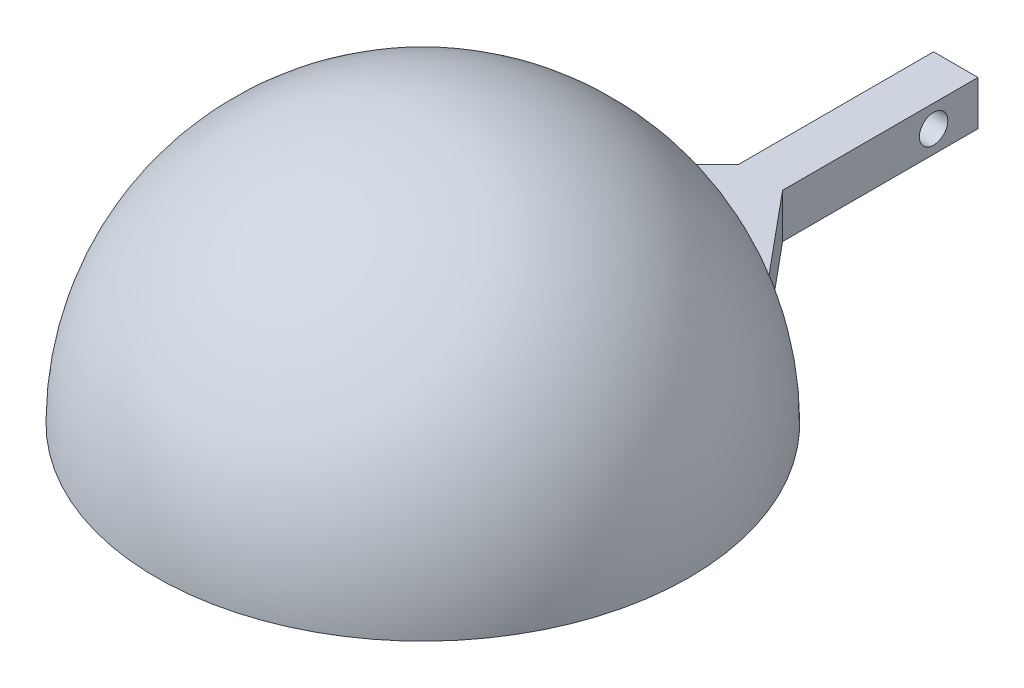
ISO-10303-21;
HEADER;
FILE_DESCRIPTION(('STEP AP214'),'2;1');
FILE_NAME('part.step','',(''),(''),'','','');
FILE_SCHEMA(('AUTOMOTIVE_DESIGN { 1 0 10303 214 1 1 1 1 }'));
ENDSEC;
DATA;
#1=APPLICATION_CONTEXT('core data for automotive mechanical design processes');
#2=APPLICATION_PROTOCOL_DEFINITION('international standard','automotive_design',2000,#1);
#3=PRODUCT_CONTEXT('',#1,'mechanical');
#4=PRODUCT('Part','Part','',(#3));
#5=PRODUCT_RELATED_PRODUCT_CATEGORY('part','',(#4));
#6=PRODUCT_DEFINITION_FORMATION('','',#4);
#7=PRODUCT_DEFINITION_CONTEXT('part definition',#1,'design');
#8=PRODUCT_DEFINITION('design','',#6,#7);
#9=PRODUCT_DEFINITION_SHAPE('','',#8);
#10=(LENGTH_UNIT() NAMED_UNIT(*) SI_UNIT(.MILLI.,.METRE.));
#11=(NAMED_UNIT(*) PLANE_ANGLE_UNIT() SI_UNIT($,.RADIAN.));
#12=(NAMED_UNIT(*) SI_UNIT($,.STERADIAN.) SOLID_ANGLE_UNIT());
#13=UNCERTAINTY_MEASURE_WITH_UNIT(LENGTH_MEASURE(1.E-05),#10,'distance_accuracy_value','');
#14=(GEOMETRIC_REPRESENTATION_CONTEXT(3) GLOBAL_UNCERTAINTY_ASSIGNED_CONTEXT((#13)) GLOBAL_UNIT_ASSIGNED_CONTEXT((#10,
#11,#12)) REPRESENTATION_CONTEXT('',''));
#15=CARTESIAN_POINT('',(0.,0.,0.));
#16=DIRECTION('',(0.,0.,1.));
#17=DIRECTION('',(1.,0.,0.));
#18=AXIS2_PLACEMENT_3D('',#15,#16,#17);
#19=CARTESIAN_POINT('',(0.,0.,0.));
#20=DIRECTION('',(0.,-1.,0.));
#21=DIRECTION('',(1.,0.,0.));
#22=AXIS2_PLACEMENT_3D('',#19,#20,#21);
#23=SPHERICAL_SURFACE('',#22,29.);
#24=CARTESIAN_POINT('',(0.,0.,1.00868727290763));
#25=DIRECTION('',(0.,0.,1.));
#26=DIRECTION('',(1.,0.,0.));
#27=AXIS2_PLACEMENT_3D('',#24,#25,#26);
#28=CIRCLE('',#27,28.9824524494646);
#29=CARTESIAN_POINT('',(0.999999999999997,28.9651954936519,1.00868727290763));
#30=VERTEX_POINT('',#29);
#31=CARTESIAN_POINT('',(22.5,18.2683483102735,1.00868727290763));
#32=VERTEX_POINT('',#31);
#33=EDGE_CURVE('E384',#30,#32,#28,.F.);
#34=ORIENTED_EDGE('',*,*,#33,.T.);
#35=CARTESIAN_POINT('',(22.5,0.,0.));
#36=DIRECTION('',(-1.,0.,0.));
#37=DIRECTION('',(0.,0.,1.));
#38=AXIS2_PLACEMENT_3D('',#35,#36,#37);
#39=CIRCLE('',#38,18.296174463532);
#40=CARTESIAN_POINT('',(22.5,18.2692993592284,-0.991312727092369));
#41=VERTEX_POINT('',#40);
#42=EDGE_CURVE('E381',#41,#32,#39,.F.);
#43=ORIENTED_EDGE('',*,*,#42,.F.);
#44=CARTESIAN_POINT('',(0.,0.,-0.991312727092369));
#45=DIRECTION('',(0.,0.,1.));
#46=DIRECTION('',(1.,0.,0.));
#47=AXIS2_PLACEMENT_3D('',#44,#45,#46);
#48=CIRCLE('',#47,28.9830519282754);
#49=CARTESIAN_POINT('',(0.999999999999997,28.9657953296143,-0.991312727092369));
#50=VERTEX_POINT('',#49);
#51=EDGE_CURVE('E376',#50,#41,#48,.F.);
#52=ORIENTED_EDGE('',*,*,#51,.F.);
#53=CARTESIAN_POINT('',(0.999999999999997,0.,0.));
#54=DIRECTION('',(-1.,0.,0.));
#55=DIRECTION('',(0.,0.,1.));
#56=AXIS2_PLACEMENT_3D('',#53,#54,#55);
#57=CIRCLE('',#56,28.9827534923789);
#58=CARTESIAN_POINT('',(0.999999999999995,18.2688259064451,-22.5));
#59=VERTEX_POINT('',#58);
#60=EDGE_CURVE('E418',#59,#50,#57,.F.);
#61=ORIENTED_EDGE('',*,*,#60,.F.);
#62=CARTESIAN_POINT('',(-1.12757025938492E-13,0.,-22.5));
#63=DIRECTION('',(0.,0.,1.));
#64=DIRECTION('',(1.,0.,0.));
#65=AXIS2_PLACEMENT_3D('',#62,#63,#64);
#66=CIRCLE('',#65,18.296174463532);
#67=CARTESIAN_POINT('',(-1.00000000000001,18.2688259064451,-22.5));
#68=VERTEX_POINT('',#67);
#69=EDGE_CURVE('E413',#68,#59,#66,.F.);
#70=ORIENTED_EDGE('',*,*,#69,.F.);
#71=CARTESIAN_POINT('',(-1.,0.,0.));
#72=DIRECTION('',(-1.,0.,0.));
#73=DIRECTION('',(0.,0.,1.));
#74=AXIS2_PLACEMENT_3D('',#71,#72,#73);
#75=CIRCLE('',#74,28.9827534923789);
#76=CARTESIAN_POINT('',(-1.,28.9657953296143,-0.991312727092369));
#77=VERTEX_POINT('',#76);
#78=EDGE_CURVE('E388',#68,#77,#75,.F.);
#79=ORIENTED_EDGE('',*,*,#78,.T.);
#80=CARTESIAN_POINT('',(-22.5,18.2692993592285,-0.991312727092369));
#81=VERTEX_POINT('',#80);
#82=EDGE_CURVE('E378',#81,#77,#48,.F.);
#83=ORIENTED_EDGE('',*,*,#82,.F.);
#84=CARTESIAN_POINT('',(-22.5,0.,0.));
#85=DIRECTION('',(-1.,0.,0.));
#86=DIRECTION('',(0.,0.,1.));
#87=AXIS2_PLACEMENT_3D('',#84,#85,#86);
#88=CIRCLE('',#87,18.2961744635321);
#89=CARTESIAN_POINT('',(-22.5,18.2683483102736,1.00868727290763));
#90=VERTEX_POINT('',#89);
#91=EDGE_CURVE('E374',#81,#90,#88,.F.);
#92=ORIENTED_EDGE('',*,*,#91,.T.);
#93=CARTESIAN_POINT('',(-1.,28.9651954936519,1.00868727290763));
#94=VERTEX_POINT('',#93);
#95=EDGE_CURVE('E410',#90,#94,#28,.F.);
#96=ORIENTED_EDGE('',*,*,#95,.T.);
#97=CARTESIAN_POINT('',(-1.,18.2688259064451,22.5));
#98=VERTEX_POINT('',#97);
#99=EDGE_CURVE('E423',#94,#98,#75,.F.);
#100=ORIENTED_EDGE('',*,*,#99,.T.);
#101=CARTESIAN_POINT('',(0.,0.,22.5));
#102=DIRECTION('',(0.,0.,1.));
#103=DIRECTION('',(1.,0.,0.));
#104=AXIS2_PLACEMENT_3D('',#101,#102,#103);
#105=CIRCLE('',#104,18.296174463532);
#106=CARTESIAN_POINT('',(1.,18.2688259064451,22.5));
#107=VERTEX_POINT('',#106);
#108=EDGE_CURVE('E421',#98,#107,#105,.F.);
#109=ORIENTED_EDGE('',*,*,#108,.T.);
#110=EDGE_CURVE('E416',#30,#107,#57,.F.);
#111=ORIENTED_EDGE('',*,*,#110,.F.);
#112=EDGE_LOOP('',(#34,#43,#52,#61,#70,#79,#83,#92,#96,#100,#109,#111));
#113=FACE_BOUND('',#112,.T.);
#114=CARTESIAN_POINT('',(0.,0.,0.));
#115=DIRECTION('',(0.,-1.,0.));
#116=DIRECTION('',(0.,0.,-1.));
#117=AXIS2_PLACEMENT_3D('',#114,#115,#116);
#118=CIRCLE('',#117,29.);
#119=CARTESIAN_POINT('',(-0.999999999999971,0.,28.9827534923789));
#120=VERTEX_POINT('',#119);
#121=CARTESIAN_POINT('',(-28.9827534923789,0.,0.999999999999726));
#122=VERTEX_POINT('',#121);
#123=EDGE_CURVE('E880',#120,#122,#118,.T.);
#124=ORIENTED_EDGE('',*,*,#123,.T.);
#125=CARTESIAN_POINT('',(0.,0.,0.99999999999993));
#126=DIRECTION('',(0.,0.,-1.));
#127=DIRECTION('',(-1.,0.,0.));
#128=AXIS2_PLACEMENT_3D('',#125,#126,#127);
#129=CIRCLE('',#128,28.9827534923789);
#130=CARTESIAN_POINT('',(-28.8270706107992,3.,0.999999999999728));
#131=VERTEX_POINT('',#130);
#132=EDGE_CURVE('E74',#131,#122,#129,.F.);
#133=ORIENTED_EDGE('',*,*,#132,.F.);
#134=CARTESIAN_POINT('',(0.,3.,0.));
#135=DIRECTION('',(0.,-1.,0.));
#136=DIRECTION('',(0.,0.,-1.));
#137=AXIS2_PLACEMENT_3D('',#134,#135,#136);
#138=CIRCLE('',#137,28.8444102037119);
#139=CARTESIAN_POINT('',(-28.8270706107992,3.,-1.00000000000027));
#140=VERTEX_POINT('',#139);
#141=EDGE_CURVE('E79',#140,#131,#138,.F.);
#142=ORIENTED_EDGE('',*,*,#141,.F.);
#143=CARTESIAN_POINT('',(0.,0.,-1.00000000000007));
#144=DIRECTION('',(0.,0.,1.));
#145=DIRECTION('',(1.,0.,0.));
#146=AXIS2_PLACEMENT_3D('',#143,#144,#145);
#147=CIRCLE('',#146,28.9827534923789);
#148=CARTESIAN_POINT('',(-28.9827534923789,0.,-1.00000000000027));
#149=VERTEX_POINT('',#148);
#150=EDGE_CURVE('E292',#149,#140,#147,.F.);
#151=ORIENTED_EDGE('',*,*,#150,.F.);
#152=CARTESIAN_POINT('',(-1.00000000000003,0.,-28.9827534923789));
#153=VERTEX_POINT('',#152);
#154=EDGE_CURVE('E272',#149,#153,#118,.T.);
#155=ORIENTED_EDGE('',*,*,#154,.T.);
#156=CARTESIAN_POINT('',(-0.99999999999993,0.,0.));
#157=DIRECTION('',(1.,0.,0.));
#158=DIRECTION('',(0.,0.,-1.));
#159=AXIS2_PLACEMENT_3D('',#156,#157,#158);
#160=CIRCLE('',#159,28.9827534923789);
#161=CARTESIAN_POINT('',(-1.00000000000003,3.,-28.8270706107992));
#162=VERTEX_POINT('',#161);
#163=EDGE_CURVE('E358',#162,#153,#160,.F.);
#164=ORIENTED_EDGE('',*,*,#163,.F.);
#165=CARTESIAN_POINT('',(0.,3.,0.));
#166=DIRECTION('',(0.,-1.,0.));
#167=DIRECTION('',(0.,0.,-1.));
#168=AXIS2_PLACEMENT_3D('',#165,#166,#167);
#169=CIRCLE('',#168,28.8444102037119);
#170=CARTESIAN_POINT('',(0.999999999999973,3.,-28.8270706107992));
#171=VERTEX_POINT('',#170);
#172=EDGE_CURVE('E362',#171,#162,#169,.F.);
#173=ORIENTED_EDGE('',*,*,#172,.F.);
#174=CARTESIAN_POINT('',(1.00000000000007,0.,0.));
#175=DIRECTION('',(-1.,0.,0.));
#176=DIRECTION('',(0.,0.,1.));
#177=AXIS2_PLACEMENT_3D('',#174,#175,#176);
#178=CIRCLE('',#177,28.9827534923789);
#179=CARTESIAN_POINT('',(0.999999999999971,0.,-28.9827534923789));
#180=VERTEX_POINT('',#179);
#181=EDGE_CURVE('E361',#180,#171,#178,.F.);
#182=ORIENTED_EDGE('',*,*,#181,.F.);
#183=CARTESIAN_POINT('',(28.9827534923789,0.,-0.99999999999993));
#184=VERTEX_POINT('',#183);
#185=EDGE_CURVE('E500',#180,#184,#118,.T.);
#186=ORIENTED_EDGE('',*,*,#185,.T.);
#187=CARTESIAN_POINT('',(0.,0.,-0.99999999999993));
#188=DIRECTION('',(0.,0.,1.));
#189=DIRECTION('',(1.,0.,0.));
#190=AXIS2_PLACEMENT_3D('',#187,#188,#189);
#191=CIRCLE('',#190,28.9827534923789);
#192=CARTESIAN_POINT('',(28.8270706107991,3.,-0.99999999999993));
#193=VERTEX_POINT('',#192);
#194=EDGE_CURVE('E327',#193,#184,#191,.F.);
#195=ORIENTED_EDGE('',*,*,#194,.F.);
#196=CARTESIAN_POINT('',(0.,3.,0.));
#197=DIRECTION('',(0.,-1.,0.));
#198=DIRECTION('',(0.,0.,-1.));
#199=AXIS2_PLACEMENT_3D('',#196,#197,#198);
#200=CIRCLE('',#199,28.8444102037119);
#201=CARTESIAN_POINT('',(28.8270706107991,3.,1.00000000000007));
#202=VERTEX_POINT('',#201);
#203=EDGE_CURVE('E331',#202,#193,#200,.F.);
#204=ORIENTED_EDGE('',*,*,#203,.F.);
#205=CARTESIAN_POINT('',(0.,0.,1.00000000000007));
#206=DIRECTION('',(0.,0.,-1.));
#207=DIRECTION('',(-1.,0.,0.));
#208=AXIS2_PLACEMENT_3D('',#205,#206,#207);
#209=CIRCLE('',#208,28.9827534923789);
#210=CARTESIAN_POINT('',(28.9827534923789,0.,1.00000000000007));
#211=VERTEX_POINT('',#210);
#212=EDGE_CURVE('E330',#211,#202,#209,.F.);
#213=ORIENTED_EDGE('',*,*,#212,.F.);
#214=CARTESIAN_POINT('',(1.00000000000003,0.,28.9827534923789));
#215=VERTEX_POINT('',#214);
#216=EDGE_CURVE('E503',#211,#215,#118,.T.);
#217=ORIENTED_EDGE('',*,*,#216,.T.);
#218=CARTESIAN_POINT('',(0.99999999999993,0.,0.));
#219=DIRECTION('',(-1.,0.,0.));
#220=DIRECTION('',(0.,0.,1.));
#221=AXIS2_PLACEMENT_3D('',#218,#219,#220);
#222=CIRCLE('',#221,28.9827534923789);
#223=CARTESIAN_POINT('',(1.00000000000003,3.,28.8270706107992));
#224=VERTEX_POINT('',#223);
#225=EDGE_CURVE('E308',#224,#215,#222,.F.);
#226=ORIENTED_EDGE('',*,*,#225,.F.);
#227=CARTESIAN_POINT('',(0.,3.,0.));
#228=DIRECTION('',(0.,-1.,0.));
#229=DIRECTION('',(0.,0.,-1.));
#230=AXIS2_PLACEMENT_3D('',#227,#228,#229);
#231=CIRCLE('',#230,28.8444102037119);
#232=CARTESIAN_POINT('',(-0.999999999999973,3.,28.8270706107992));
#233=VERTEX_POINT('',#232);
#234=EDGE_CURVE('E312',#233,#224,#231,.F.);
#235=ORIENTED_EDGE('',*,*,#234,.F.);
#236=CARTESIAN_POINT('',(-1.00000000000007,0.,0.));
#237=DIRECTION('',(1.,0.,0.));
#238=DIRECTION('',(0.,0.,-1.));
#239=AXIS2_PLACEMENT_3D('',#236,#237,#238);
#240=CIRCLE('',#239,28.9827534923789);
#241=EDGE_CURVE('E311',#120,#233,#240,.F.);
#242=ORIENTED_EDGE('',*,*,#241,.F.);
#243=EDGE_LOOP('',(#124,#133,#142,#151,#155,#164,#173,#182,#186,#195,#204,#213,#217,#226,#235,#242));
#244=FACE_BOUND('',#243,.T.);
#245=ADVANCED_FACE('F59',(#113,#244),#23,.F.);
#246=CARTESIAN_POINT('',(-22.5,30.001,1.00868727290763));
#247=DIRECTION('',(-1.,0.,0.));
#248=DIRECTION('',(0.,0.,1.));
#249=AXIS2_PLACEMENT_3D('',#246,#247,#248);
#250=PLANE('',#249);
#251=DIRECTION('',(0.,-1.,0.));
#252=VECTOR('',#251,1.);
#253=CARTESIAN_POINT('',(-22.5,30.001,-0.991312727092369));
#254=LINE('',#253,#252);
#255=CARTESIAN_POINT('',(-22.5,3.,-0.991312727092369));
#256=VERTEX_POINT('',#255);
#257=EDGE_CURVE('E404',#81,#256,#254,.T.);
#258=ORIENTED_EDGE('',*,*,#257,.T.);
#259=DIRECTION('',(0.,0.,-1.));
#260=VECTOR('',#259,1.);
#261=CARTESIAN_POINT('',(-22.5,3.,-1.00000000000023));
#262=LINE('',#261,#260);
#263=CARTESIAN_POINT('',(-22.5,3.,0.999999999999773));
#264=VERTEX_POINT('',#263);
#265=EDGE_CURVE('E298',#264,#256,#262,.T.);
#266=ORIENTED_EDGE('',*,*,#265,.F.);
#267=DIRECTION('',(0.,1.,0.));
#268=VECTOR('',#267,1.);
#269=CARTESIAN_POINT('',(-22.5,0.,0.999999999999773));
#270=LINE('',#269,#268);
#271=CARTESIAN_POINT('',(-22.5,0.,0.999999999999773));
#272=VERTEX_POINT('',#271);
#273=EDGE_CURVE('E284',#272,#264,#270,.T.);
#274=ORIENTED_EDGE('',*,*,#273,.F.);
#275=DIRECTION('',(0.,0.,-1.));
#276=VECTOR('',#275,1.);
#277=CARTESIAN_POINT('',(-22.5,0.,1.00868727290763));
#278=LINE('',#277,#276);
#279=CARTESIAN_POINT('',(-22.5,0.,1.00868727290763));
#280=VERTEX_POINT('',#279);
#281=EDGE_CURVE('E392',#280,#272,#278,.T.);
#282=ORIENTED_EDGE('',*,*,#281,.F.);
#283=DIRECTION('',(0.,-1.,0.));
#284=VECTOR('',#283,1.);
#285=CARTESIAN_POINT('',(-22.5,30.001,1.00868727290763));
#286=LINE('',#285,#284);
#287=EDGE_CURVE('E401',#90,#280,#286,.T.);
#288=ORIENTED_EDGE('',*,*,#287,.F.);
#289=ORIENTED_EDGE('',*,*,#91,.F.);
#290=EDGE_LOOP('',(#258,#266,#274,#282,#288,#289));
#291=FACE_BOUND('',#290,.T.);
#292=ADVANCED_FACE('F531',(#291),#250,.T.);
#293=CARTESIAN_POINT('',(1.,30.001,22.5));
#294=DIRECTION('',(0.,0.,1.));
#295=DIRECTION('',(1.,0.,0.));
#296=AXIS2_PLACEMENT_3D('',#293,#294,#295);
#297=PLANE('',#296);
#298=DIRECTION('',(0.,-1.,0.));
#299=VECTOR('',#298,1.);
#300=CARTESIAN_POINT('',(-1.,30.001,22.5));
#301=LINE('',#300,#299);
#302=CARTESIAN_POINT('',(-1.,3.,22.5));
#303=VERTEX_POINT('',#302);
#304=EDGE_CURVE('E431',#98,#303,#301,.T.);
#305=ORIENTED_EDGE('',*,*,#304,.T.);
#306=DIRECTION('',(-1.,0.,0.));
#307=VECTOR('',#306,1.);
#308=CARTESIAN_POINT('',(-0.999999999999995,3.,22.5));
#309=LINE('',#308,#307);
#310=CARTESIAN_POINT('',(1.,3.,22.5));
#311=VERTEX_POINT('',#310);
#312=EDGE_CURVE('E316',#311,#303,#309,.T.);
#313=ORIENTED_EDGE('',*,*,#312,.F.);
#314=DIRECTION('',(0.,-1.,0.));
#315=VECTOR('',#314,1.);
#316=CARTESIAN_POINT('',(1.,30.001,22.5));
#317=LINE('',#316,#315);
#318=EDGE_CURVE('E417',#107,#311,#317,.T.);
#319=ORIENTED_EDGE('',*,*,#318,.F.);
#320=ORIENTED_EDGE('',*,*,#108,.F.);
#321=EDGE_LOOP('',(#305,#313,#319,#320));
#322=FACE_BOUND('',#321,.T.);
#323=ADVANCED_FACE('F537',(#322),#297,.T.);
#324=CARTESIAN_POINT('',(22.5,30.001,1.00868727290763));
#325=DIRECTION('',(-1.,0.,0.));
#326=DIRECTION('',(0.,0.,1.));
#327=AXIS2_PLACEMENT_3D('',#324,#325,#326);
#328=PLANE('',#327);
#329=DIRECTION('',(0.,0.,1.));
#330=VECTOR('',#329,1.);
#331=CARTESIAN_POINT('',(22.5,3.,1.00868727290763));
#332=LINE('',#331,#330);
#333=CARTESIAN_POINT('',(22.5,3.,-0.991312727092369));
#334=VERTEX_POINT('',#333);
#335=CARTESIAN_POINT('',(22.5,3.,1.00000000000007));
#336=VERTEX_POINT('',#335);
#337=EDGE_CURVE('E12',#334,#336,#332,.T.);
#338=ORIENTED_EDGE('',*,*,#337,.F.);
#339=DIRECTION('',(0.,-1.,0.));
#340=VECTOR('',#339,1.);
#341=CARTESIAN_POINT('',(22.5,30.001,-0.991312727092369));
#342=LINE('',#341,#340);
#343=EDGE_CURVE('E377',#41,#334,#342,.T.);
#344=ORIENTED_EDGE('',*,*,#343,.F.);
#345=ORIENTED_EDGE('',*,*,#42,.T.);
#346=DIRECTION('',(0.,-1.,0.));
#347=VECTOR('',#346,1.);
#348=CARTESIAN_POINT('',(22.5,30.001,1.00868727290763));
#349=LINE('',#348,#347);
#350=CARTESIAN_POINT('',(22.5,0.,1.00868727290763));
#351=VERTEX_POINT('',#350);
#352=EDGE_CURVE('E399',#32,#351,#349,.T.);
#353=ORIENTED_EDGE('',*,*,#352,.T.);
#354=DIRECTION('',(0.,0.,-1.));
#355=VECTOR('',#354,1.);
#356=CARTESIAN_POINT('',(22.5,0.,1.00868727290763));
#357=LINE('',#356,#355);
#358=CARTESIAN_POINT('',(22.5,0.,1.00000000000007));
#359=VERTEX_POINT('',#358);
#360=EDGE_CURVE('E385',#351,#359,#357,.T.);
#361=ORIENTED_EDGE('',*,*,#360,.T.);
#362=DIRECTION('',(0.,-1.,0.));
#363=VECTOR('',#362,1.);
#364=CARTESIAN_POINT('',(22.5,0.,1.00000000000007));
#365=LINE('',#364,#363);
#366=EDGE_CURVE('E315',#336,#359,#365,.T.);
#367=ORIENTED_EDGE('',*,*,#366,.F.);
#368=EDGE_LOOP('',(#338,#344,#345,#353,#361,#367));
#369=FACE_BOUND('',#368,.T.);
#370=ADVANCED_FACE('F555',(#369),#328,.F.);
#371=CARTESIAN_POINT('',(0.999999999999995,30.001,-22.5));
#372=DIRECTION('',(0.,0.,1.));
#373=DIRECTION('',(1.,0.,0.));
#374=AXIS2_PLACEMENT_3D('',#371,#372,#373);
#375=PLANE('',#374);
#376=DIRECTION('',(1.,0.,0.));
#377=VECTOR('',#376,1.);
#378=CARTESIAN_POINT('',(0.999999999999995,3.,-22.5));
#379=LINE('',#378,#377);
#380=CARTESIAN_POINT('',(-1.00000000000001,3.,-22.5));
#381=VERTEX_POINT('',#380);
#382=CARTESIAN_POINT('',(0.999999999999995,3.,-22.5));
#383=VERTEX_POINT('',#382);
#384=EDGE_CURVE('E334',#381,#383,#379,.T.);
#385=ORIENTED_EDGE('',*,*,#384,.F.);
#386=DIRECTION('',(0.,-1.,0.));
#387=VECTOR('',#386,1.);
#388=CARTESIAN_POINT('',(-1.00000000000001,30.001,-22.5));
#389=LINE('',#388,#387);
#390=EDGE_CURVE('E437',#68,#381,#389,.T.);
#391=ORIENTED_EDGE('',*,*,#390,.F.);
#392=ORIENTED_EDGE('',*,*,#69,.T.);
#393=DIRECTION('',(0.,-1.,0.));
#394=VECTOR('',#393,1.);
#395=CARTESIAN_POINT('',(0.999999999999995,30.001,-22.5));
#396=LINE('',#395,#394);
#397=EDGE_CURVE('E434',#59,#383,#396,.T.);
#398=ORIENTED_EDGE('',*,*,#397,.T.);
#399=EDGE_LOOP('',(#385,#391,#392,#398));
#400=FACE_BOUND('',#399,.T.);
#401=ADVANCED_FACE('F550',(#400),#375,.F.);
#402=CARTESIAN_POINT('',(0.,0.,0.));
#403=DIRECTION('',(0.,-1.,0.));
#404=DIRECTION('',(1.,0.,0.));
#405=AXIS2_PLACEMENT_3D('',#402,#403,#404);
#406=SPHERICAL_SURFACE('',#405,30.);
#407=CARTESIAN_POINT('',(0.,5.,0.));
#408=DIRECTION('',(0.,-1.,0.));
#409=DIRECTION('',(0.,0.,-1.));
#410=AXIS2_PLACEMENT_3D('',#407,#408,#409);
#411=CIRCLE('',#410,29.5803989154981);
#412=CARTESIAN_POINT('',(11.4025555446812,5.,-27.2943533913237));
#413=VERTEX_POINT('',#412);
#414=CARTESIAN_POINT('',(-14.2166838766896,5.,-25.9400443243699));
#415=VERTEX_POINT('',#414);
#416=EDGE_CURVE('E67',#413,#415,#411,.F.);
#417=ORIENTED_EDGE('',*,*,#416,.T.);
#418=CARTESIAN_POINT('',(0.,0.,0.));
#419=DIRECTION('',(0.876933553143501,0.,-0.48061163466058));
#420=DIRECTION('',(-0.48061163466058,0.,-0.876933553143501));
#421=AXIS2_PLACEMENT_3D('',#418,#419,#420);
#422=CIRCLE('',#421,30.);
#423=CARTESIAN_POINT('',(-14.4183490398174,0.,-26.308006594305));
#424=VERTEX_POINT('',#423);
#425=EDGE_CURVE('E486',#415,#424,#422,.F.);
#426=ORIENTED_EDGE('',*,*,#425,.T.);
#427=CARTESIAN_POINT('',(0.,0.,0.));
#428=DIRECTION('',(0.,-1.,0.));
#429=DIRECTION('',(0.,0.,-1.));
#430=AXIS2_PLACEMENT_3D('',#427,#428,#429);
#431=CIRCLE('',#430,30.);
#432=CARTESIAN_POINT('',(10.8372340252813,0.,-27.9741730651915));
#433=VERTEX_POINT('',#432);
#434=EDGE_CURVE('E502',#433,#424,#431,.T.);
#435=ORIENTED_EDGE('',*,*,#434,.F.);
#436=CARTESIAN_POINT('',(20.1593324272442,0.,-16.764010922216));
#437=DIRECTION('',(0.768885498760629,0.,-0.639386494849257));
#438=DIRECTION('',(-0.639386494849257,0.,-0.768885498760629));
#439=AXIS2_PLACEMENT_3D('',#436,#437,#438);
#440=CIRCLE('',#439,14.5797549323603);
#441=EDGE_CURVE('E497',#413,#433,#440,.F.);
#442=ORIENTED_EDGE('',*,*,#441,.F.);
#443=EDGE_LOOP('',(#417,#426,#435,#442));
#444=FACE_BOUND('',#443,.T.);
#445=ADVANCED_FACE('F61',(#444),#406,.T.);
#446=CARTESIAN_POINT('',(29.,0.,0.));
#447=DIRECTION('',(0.,-1.,0.));
#448=DIRECTION('',(0.,0.,-1.));
#449=AXIS2_PLACEMENT_3D('',#446,#447,#448);
#450=PLANE('',#449);
#451=ORIENTED_EDGE('',*,*,#154,.F.);
#452=DIRECTION('',(1.,0.,0.));
#453=VECTOR('',#452,1.);
#454=CARTESIAN_POINT('',(-30.0010000000004,0.,-1.00000000000028));
#455=LINE('',#454,#453);
#456=CARTESIAN_POINT('',(-22.5,0.,-1.00000000000023));
#457=VERTEX_POINT('',#456);
#458=EDGE_CURVE('E265',#149,#457,#455,.T.);
#459=ORIENTED_EDGE('',*,*,#458,.T.);
#460=DIRECTION('',(0.,0.,1.));
#461=VECTOR('',#460,1.);
#462=CARTESIAN_POINT('',(-22.5,0.,-1.00000000000023));
#463=LINE('',#462,#461);
#464=CARTESIAN_POINT('',(-22.5,0.,-0.991312727092369));
#465=VERTEX_POINT('',#464);
#466=EDGE_CURVE('E270',#457,#465,#463,.T.);
#467=ORIENTED_EDGE('',*,*,#466,.T.);
#468=DIRECTION('',(-1.,0.,0.));
#469=VECTOR('',#468,1.);
#470=CARTESIAN_POINT('',(22.5,0.,-0.991312727092369));
#471=LINE('',#470,#469);
#472=CARTESIAN_POINT('',(-0.999999999999997,0.,-0.991312727092369));
#473=VERTEX_POINT('',#472);
#474=EDGE_CURVE('E387',#473,#465,#471,.T.);
#475=ORIENTED_EDGE('',*,*,#474,.F.);
#476=DIRECTION('',(0.,0.,-1.));
#477=VECTOR('',#476,1.);
#478=CARTESIAN_POINT('',(-1.,0.,22.5));
#479=LINE('',#478,#477);
#480=EDGE_CURVE('E365',#473,#153,#479,.T.);
#481=ORIENTED_EDGE('',*,*,#480,.T.);
#482=EDGE_LOOP('',(#451,#459,#467,#475,#481));
#483=FACE_BOUND('',#482,.T.);
#484=ORIENTED_EDGE('',*,*,#123,.F.);
#485=CARTESIAN_POINT('',(-0.999999999999997,0.,1.00868727290763));
#486=VERTEX_POINT('',#485);
#487=EDGE_CURVE('E424',#120,#486,#479,.T.);
#488=ORIENTED_EDGE('',*,*,#487,.T.);
#489=DIRECTION('',(-1.,0.,0.));
#490=VECTOR('',#489,1.);
#491=CARTESIAN_POINT('',(22.5,0.,1.00868727290763));
#492=LINE('',#491,#490);
#493=EDGE_CURVE('E395',#486,#280,#492,.T.);
#494=ORIENTED_EDGE('',*,*,#493,.T.);
#495=ORIENTED_EDGE('',*,*,#281,.T.);
#496=DIRECTION('',(1.,0.,0.));
#497=VECTOR('',#496,1.);
#498=CARTESIAN_POINT('',(-30.0010000000004,0.,0.99999999999972));
#499=LINE('',#498,#497);
#500=EDGE_CURVE('E275',#122,#272,#499,.T.);
#501=ORIENTED_EDGE('',*,*,#500,.F.);
#502=EDGE_LOOP('',(#484,#488,#494,#495,#501));
#503=FACE_BOUND('',#502,.T.);
#504=ORIENTED_EDGE('',*,*,#216,.F.);
#505=DIRECTION('',(-1.,0.,0.));
#506=VECTOR('',#505,1.);
#507=CARTESIAN_POINT('',(30.001,0.,1.00000000000007));
#508=LINE('',#507,#506);
#509=EDGE_CURVE('E353',#211,#359,#508,.T.);
#510=ORIENTED_EDGE('',*,*,#509,.T.);
#511=ORIENTED_EDGE('',*,*,#360,.F.);
#512=CARTESIAN_POINT('',(1.,0.,1.00868727290763));
#513=VERTEX_POINT('',#512);
#514=EDGE_CURVE('E396',#351,#513,#492,.T.);
#515=ORIENTED_EDGE('',*,*,#514,.T.);
#516=DIRECTION('',(0.,0.,-1.));
#517=VECTOR('',#516,1.);
#518=CARTESIAN_POINT('',(1.,0.,22.5));
#519=LINE('',#518,#517);
#520=EDGE_CURVE('E428',#215,#513,#519,.T.);
#521=ORIENTED_EDGE('',*,*,#520,.F.);
#522=EDGE_LOOP('',(#504,#510,#511,#515,#521));
#523=FACE_BOUND('',#522,.T.);
#524=ORIENTED_EDGE('',*,*,#185,.F.);
#525=CARTESIAN_POINT('',(1.,0.,-0.991312727092369));
#526=VERTEX_POINT('',#525);
#527=EDGE_CURVE('E427',#526,#180,#519,.T.);
#528=ORIENTED_EDGE('',*,*,#527,.F.);
#529=CARTESIAN_POINT('',(22.5,0.,-0.991312727092369));
#530=VERTEX_POINT('',#529);
#531=EDGE_CURVE('E389',#530,#526,#471,.T.);
#532=ORIENTED_EDGE('',*,*,#531,.F.);
#533=DIRECTION('',(0.,0.,-1.));
#534=VECTOR('',#533,1.);
#535=CARTESIAN_POINT('',(22.5,0.,1.00000000000007));
#536=LINE('',#535,#534);
#537=CARTESIAN_POINT('',(22.5,0.,-0.99999999999993));
#538=VERTEX_POINT('',#537);
#539=EDGE_CURVE('E337',#530,#538,#536,.T.);
#540=ORIENTED_EDGE('',*,*,#539,.T.);
#541=DIRECTION('',(-1.,0.,0.));
#542=VECTOR('',#541,1.);
#543=CARTESIAN_POINT('',(30.001,0.,-0.99999999999993));
#544=LINE('',#543,#542);
#545=EDGE_CURVE('E350',#184,#538,#544,.T.);
#546=ORIENTED_EDGE('',*,*,#545,.F.);
#547=EDGE_LOOP('',(#524,#528,#532,#540,#546));
#548=FACE_BOUND('',#547,.T.);
#549=ORIENTED_EDGE('',*,*,#434,.T.);
#550=DIRECTION('',(-0.713853106643577,0.,0.700295467738663));
#551=VECTOR('',#550,1.);
#552=CARTESIAN_POINT('',(-20.2225419734574,0.,-20.6140480368922));
#553=LINE('',#552,#551);
#554=CARTESIAN_POINT('',(-2.5,0.,-38.));
#555=VERTEX_POINT('',#554);
#556=EDGE_CURVE('E472',#555,#424,#553,.T.);
#557=ORIENTED_EDGE('',*,*,#556,.F.);
#558=DIRECTION('',(0.,0.,1.));
#559=VECTOR('',#558,1.);
#560=CARTESIAN_POINT('',(-2.50000000000001,0.,0.));
#561=LINE('',#560,#559);
#562=CARTESIAN_POINT('',(-2.5,0.,-60.));
#563=VERTEX_POINT('',#562);
#564=EDGE_CURVE('E475',#563,#555,#561,.T.);
#565=ORIENTED_EDGE('',*,*,#564,.F.);
#566=DIRECTION('',(1.,0.,0.));
#567=VECTOR('',#566,1.);
#568=CARTESIAN_POINT('',(0.,0.,-60.));
#569=LINE('',#568,#567);
#570=CARTESIAN_POINT('',(2.5,0.,-60.));
#571=VERTEX_POINT('',#570);
#572=EDGE_CURVE('E477',#563,#571,#569,.T.);
#573=ORIENTED_EDGE('',*,*,#572,.T.);
#574=DIRECTION('',(0.,0.,1.));
#575=VECTOR('',#574,1.);
#576=CARTESIAN_POINT('',(2.5,0.,0.));
#577=LINE('',#576,#575);
#578=CARTESIAN_POINT('',(2.5,0.,-38.));
#579=VERTEX_POINT('',#578);
#580=EDGE_CURVE('E480',#571,#579,#577,.T.);
#581=ORIENTED_EDGE('',*,*,#580,.T.);
#582=DIRECTION('',(0.639386494849257,0.,0.768885498760629));
#583=VECTOR('',#582,1.);
#584=CARTESIAN_POINT('',(20.1593324272442,0.,-16.764010922216));
#585=LINE('',#584,#583);
#586=EDGE_CURVE('E457',#579,#433,#585,.T.);
#587=ORIENTED_EDGE('',*,*,#586,.T.);
#588=EDGE_LOOP('',(#549,#557,#565,#573,#581,#587));
#589=FACE_BOUND('',#588,.T.);
#590=ADVANCED_FACE('F267',(#483,#503,#523,#548,#589),#450,.T.);
#591=CARTESIAN_POINT('',(-20.2225419734574,5.,-20.6140480368922));
#592=DIRECTION('',(0.700295467738663,0.,0.713853106643577));
#593=DIRECTION('',(0.713853106643577,0.,-0.700295467738663));
#594=AXIS2_PLACEMENT_3D('',#591,#592,#593);
#595=PLANE('',#594);
#596=ORIENTED_EDGE('',*,*,#556,.T.);
#597=DIRECTION('',(0.,-1.,0.));
#598=VECTOR('',#597,1.);
#599=CARTESIAN_POINT('',(-14.4183490398174,5.,-26.308006594305));
#600=LINE('',#599,#598);
#601=CARTESIAN_POINT('',(-14.4183490398174,5.,-26.308006594305));
#602=VERTEX_POINT('',#601);
#603=EDGE_CURVE('E484',#602,#424,#600,.T.);
#604=ORIENTED_EDGE('',*,*,#603,.F.);
#605=DIRECTION('',(-0.713853106643577,0.,0.700295467738663));
#606=VECTOR('',#605,1.);
#607=CARTESIAN_POINT('',(-20.2225419734574,5.,-20.6140480368922));
#608=LINE('',#607,#606);
#609=CARTESIAN_POINT('',(-2.5,5.,-38.));
#610=VERTEX_POINT('',#609);
#611=EDGE_CURVE('E453',#610,#602,#608,.T.);
#612=ORIENTED_EDGE('',*,*,#611,.F.);
#613=DIRECTION('',(0.,-1.,0.));
#614=VECTOR('',#613,1.);
#615=CARTESIAN_POINT('',(-2.5,5.,-38.));
#616=LINE('',#615,#614);
#617=EDGE_CURVE('E471',#610,#555,#616,.T.);
#618=ORIENTED_EDGE('',*,*,#617,.T.);
#619=EDGE_LOOP('',(#596,#604,#612,#618));
#620=FACE_BOUND('',#619,.T.);
#621=ADVANCED_FACE('F541',(#620),#595,.F.);
#622=CARTESIAN_POINT('',(0.,5.,0.));
#623=DIRECTION('',(0.876933553143501,0.,-0.48061163466058));
#624=DIRECTION('',(-0.48061163466058,0.,-0.876933553143501));
#625=AXIS2_PLACEMENT_3D('',#622,#623,#624);
#626=PLANE('',#625);
#627=ORIENTED_EDGE('',*,*,#425,.F.);
#628=DIRECTION('',(0.48061163466058,0.,0.876933553143501));
#629=VECTOR('',#628,1.);
#630=CARTESIAN_POINT('',(0.,5.,0.));
#631=LINE('',#630,#629);
#632=EDGE_CURVE('E468',#602,#415,#631,.T.);
#633=ORIENTED_EDGE('',*,*,#632,.F.);
#634=ORIENTED_EDGE('',*,*,#603,.T.);
#635=EDGE_LOOP('',(#627,#633,#634));
#636=FACE_BOUND('',#635,.T.);
#637=ADVANCED_FACE('F548',(#636),#626,.F.);
#638=CARTESIAN_POINT('',(20.1593324272442,5.,-16.764010922216));
#639=DIRECTION('',(0.768885498760629,0.,-0.639386494849257));
#640=DIRECTION('',(-0.639386494849257,0.,-0.768885498760629));
#641=AXIS2_PLACEMENT_3D('',#638,#639,#640);
#642=PLANE('',#641);
#643=DIRECTION('',(0.639386494849257,0.,0.768885498760629));
#644=VECTOR('',#643,1.);
#645=CARTESIAN_POINT('',(20.1593324272442,5.,-16.764010922216));
#646=LINE('',#645,#644);
#647=CARTESIAN_POINT('',(2.5,5.,-38.));
#648=VERTEX_POINT('',#647);
#649=EDGE_CURVE('E465',#648,#413,#646,.T.);
#650=ORIENTED_EDGE('',*,*,#649,.T.);
#651=ORIENTED_EDGE('',*,*,#441,.T.);
#652=ORIENTED_EDGE('',*,*,#586,.F.);
#653=DIRECTION('',(0.,-1.,0.));
#654=VECTOR('',#653,1.);
#655=CARTESIAN_POINT('',(2.5,5.,-38.));
#656=LINE('',#655,#654);
#657=EDGE_CURVE('E487',#648,#579,#656,.T.);
#658=ORIENTED_EDGE('',*,*,#657,.F.);
#659=EDGE_LOOP('',(#650,#651,#652,#658));
#660=FACE_BOUND('',#659,.T.);
#661=ADVANCED_FACE('F563',(#660),#642,.T.);
#662=CARTESIAN_POINT('',(2.5,5.,0.));
#663=DIRECTION('',(1.,0.,0.));
#664=DIRECTION('',(0.,0.,-1.));
#665=AXIS2_PLACEMENT_3D('',#662,#663,#664);
#666=PLANE('',#665);
#667=CARTESIAN_POINT('',(2.5,2.5,-55.));
#668=DIRECTION('',(1.,0.,0.));
#669=DIRECTION('',(0.,0.,-1.));
#670=AXIS2_PLACEMENT_3D('',#667,#668,#669);
#671=CIRCLE('',#670,1.6);
#672=CARTESIAN_POINT('',(2.5,2.5,-56.6));
#673=VERTEX_POINT('',#672);
#674=EDGE_CURVE('E449',#673,#673,#671,.T.);
#675=ORIENTED_EDGE('',*,*,#674,.F.);
#676=EDGE_LOOP('',(#675));
#677=FACE_BOUND('',#676,.T.);
#678=ORIENTED_EDGE('',*,*,#580,.F.);
#679=DIRECTION('',(0.,-1.,0.));
#680=VECTOR('',#679,1.);
#681=CARTESIAN_POINT('',(2.5,5.,-60.));
#682=LINE('',#681,#680);
#683=CARTESIAN_POINT('',(2.5,5.,-60.));
#684=VERTEX_POINT('',#683);
#685=EDGE_CURVE('E489',#684,#571,#682,.T.);
#686=ORIENTED_EDGE('',*,*,#685,.F.);
#687=DIRECTION('',(0.,0.,1.));
#688=VECTOR('',#687,1.);
#689=CARTESIAN_POINT('',(2.5,5.,0.));
#690=LINE('',#689,#688);
#691=EDGE_CURVE('E462',#684,#648,#690,.T.);
#692=ORIENTED_EDGE('',*,*,#691,.T.);
#693=ORIENTED_EDGE('',*,*,#657,.T.);
#694=EDGE_LOOP('',(#678,#686,#692,#693));
#695=FACE_BOUND('',#694,.T.);
#696=ADVANCED_FACE('F567',(#677,#695),#666,.T.);
#697=CARTESIAN_POINT('',(0.,5.,-60.));
#698=DIRECTION('',(0.,0.,-1.));
#699=DIRECTION('',(-1.,0.,0.));
#700=AXIS2_PLACEMENT_3D('',#697,#698,#699);
#701=PLANE('',#700);
#702=ORIENTED_EDGE('',*,*,#572,.F.);
#703=DIRECTION('',(0.,-1.,0.));
#704=VECTOR('',#703,1.);
#705=CARTESIAN_POINT('',(-2.5,5.,-60.));
#706=LINE('',#705,#704);
#707=CARTESIAN_POINT('',(-2.5,5.,-60.));
#708=VERTEX_POINT('',#707);
#709=EDGE_CURVE('E491',#708,#563,#706,.T.);
#710=ORIENTED_EDGE('',*,*,#709,.F.);
#711=DIRECTION('',(1.,0.,0.));
#712=VECTOR('',#711,1.);
#713=CARTESIAN_POINT('',(0.,5.,-60.));
#714=LINE('',#713,#712);
#715=EDGE_CURVE('E459',#708,#684,#714,.T.);
#716=ORIENTED_EDGE('',*,*,#715,.T.);
#717=ORIENTED_EDGE('',*,*,#685,.T.);
#718=EDGE_LOOP('',(#702,#710,#716,#717));
#719=FACE_BOUND('',#718,.T.);
#720=ADVANCED_FACE('F571',(#719),#701,.T.);
#721=CARTESIAN_POINT('',(-2.50000000000001,5.,0.));
#722=DIRECTION('',(1.,0.,0.));
#723=DIRECTION('',(0.,0.,-1.));
#724=AXIS2_PLACEMENT_3D('',#721,#722,#723);
#725=PLANE('',#724);
#726=CARTESIAN_POINT('',(-2.5,2.5,-55.));
#727=DIRECTION('',(1.,0.,0.));
#728=DIRECTION('',(0.,0.,-1.));
#729=AXIS2_PLACEMENT_3D('',#726,#727,#728);
#730=CIRCLE('',#729,1.6);
#731=CARTESIAN_POINT('',(-2.5,2.5,-56.6));
#732=VERTEX_POINT('',#731);
#733=EDGE_CURVE('E452',#732,#732,#730,.T.);
#734=ORIENTED_EDGE('',*,*,#733,.T.);
#735=EDGE_LOOP('',(#734));
#736=FACE_BOUND('',#735,.T.);
#737=ORIENTED_EDGE('',*,*,#564,.T.);
#738=ORIENTED_EDGE('',*,*,#617,.F.);
#739=DIRECTION('',(0.,0.,1.));
#740=VECTOR('',#739,1.);
#741=CARTESIAN_POINT('',(-2.50000000000001,5.,0.));
#742=LINE('',#741,#740);
#743=EDGE_CURVE('E456',#708,#610,#742,.T.);
#744=ORIENTED_EDGE('',*,*,#743,.F.);
#745=ORIENTED_EDGE('',*,*,#709,.T.);
#746=EDGE_LOOP('',(#737,#738,#744,#745));
#747=FACE_BOUND('',#746,.T.);
#748=ADVANCED_FACE('F510',(#736,#747),#725,.F.);
#749=CARTESIAN_POINT('',(0.,5.,0.));
#750=DIRECTION('',(0.,-1.,0.));
#751=DIRECTION('',(0.,0.,-1.));
#752=AXIS2_PLACEMENT_3D('',#749,#750,#751);
#753=PLANE('',#752);
#754=ORIENTED_EDGE('',*,*,#416,.F.);
#755=ORIENTED_EDGE('',*,*,#649,.F.);
#756=ORIENTED_EDGE('',*,*,#691,.F.);
#757=ORIENTED_EDGE('',*,*,#715,.F.);
#758=ORIENTED_EDGE('',*,*,#743,.T.);
#759=ORIENTED_EDGE('',*,*,#611,.T.);
#760=ORIENTED_EDGE('',*,*,#632,.T.);
#761=EDGE_LOOP('',(#754,#755,#756,#757,#758,#759,#760));
#762=FACE_BOUND('',#761,.T.);
#763=ADVANCED_FACE('F516',(#762),#753,.F.);
#764=CARTESIAN_POINT('',(-30.,2.5,-55.));
#765=DIRECTION('',(1.,0.,0.));
#766=DIRECTION('',(0.,0.,-1.));
#767=AXIS2_PLACEMENT_3D('',#764,#765,#766);
#768=CYLINDRICAL_SURFACE('',#767,1.6);
#769=ORIENTED_EDGE('',*,*,#674,.T.);
#770=EDGE_LOOP('',(#769));
#771=FACE_BOUND('',#770,.T.);
#772=ORIENTED_EDGE('',*,*,#733,.F.);
#773=EDGE_LOOP('',(#772));
#774=FACE_BOUND('',#773,.T.);
#775=ADVANCED_FACE('F513',(#771,#774),#768,.F.);
#776=CARTESIAN_POINT('',(22.5,30.001,-0.991312727092369));
#777=DIRECTION('',(0.,0.,1.));
#778=DIRECTION('',(1.,0.,0.));
#779=AXIS2_PLACEMENT_3D('',#776,#777,#778);
#780=PLANE('',#779);
#781=ORIENTED_EDGE('',*,*,#82,.T.);
#782=DIRECTION('',(0.,-1.,0.));
#783=VECTOR('',#782,1.);
#784=CARTESIAN_POINT('',(-1.,30.001,-0.991312727092369));
#785=LINE('',#784,#783);
#786=EDGE_CURVE('E444',#77,#473,#785,.T.);
#787=ORIENTED_EDGE('',*,*,#786,.T.);
#788=ORIENTED_EDGE('',*,*,#474,.T.);
#789=EDGE_CURVE('E283',#256,#465,#254,.T.);
#790=ORIENTED_EDGE('',*,*,#789,.F.);
#791=ORIENTED_EDGE('',*,*,#257,.F.);
#792=EDGE_LOOP('',(#781,#787,#788,#790,#791));
#793=FACE_BOUND('',#792,.T.);
#794=ADVANCED_FACE('F515',(#793),#780,.F.);
#795=CARTESIAN_POINT('',(22.5,30.001,1.00868727290763));
#796=DIRECTION('',(0.,0.,1.));
#797=DIRECTION('',(1.,0.,0.));
#798=AXIS2_PLACEMENT_3D('',#795,#796,#797);
#799=PLANE('',#798);
#800=DIRECTION('',(0.,-1.,0.));
#801=VECTOR('',#800,1.);
#802=CARTESIAN_POINT('',(-1.,30.001,1.00868727290763));
#803=LINE('',#802,#801);
#804=EDGE_CURVE('E412',#94,#486,#803,.T.);
#805=ORIENTED_EDGE('',*,*,#804,.F.);
#806=ORIENTED_EDGE('',*,*,#95,.F.);
#807=ORIENTED_EDGE('',*,*,#287,.T.);
#808=ORIENTED_EDGE('',*,*,#493,.F.);
#809=EDGE_LOOP('',(#805,#806,#807,#808));
#810=FACE_BOUND('',#809,.T.);
#811=ADVANCED_FACE('F523',(#810),#799,.T.);
#812=DIRECTION('',(0.,-1.,0.));
#813=VECTOR('',#812,1.);
#814=CARTESIAN_POINT('',(0.999999999999997,30.001,-0.991312727092369));
#815=LINE('',#814,#813);
#816=EDGE_CURVE('E446',#50,#526,#815,.T.);
#817=ORIENTED_EDGE('',*,*,#816,.F.);
#818=ORIENTED_EDGE('',*,*,#51,.T.);
#819=ORIENTED_EDGE('',*,*,#343,.T.);
#820=EDGE_CURVE('E407',#334,#530,#342,.T.);
#821=ORIENTED_EDGE('',*,*,#820,.T.);
#822=ORIENTED_EDGE('',*,*,#531,.T.);
#823=EDGE_LOOP('',(#817,#818,#819,#821,#822));
#824=FACE_BOUND('',#823,.T.);
#825=ADVANCED_FACE('F526',(#824),#780,.F.);
#826=ORIENTED_EDGE('',*,*,#33,.F.);
#827=DIRECTION('',(0.,-1.,0.));
#828=VECTOR('',#827,1.);
#829=CARTESIAN_POINT('',(0.999999999999997,30.001,1.00868727290763));
#830=LINE('',#829,#828);
#831=EDGE_CURVE('E443',#30,#513,#830,.T.);
#832=ORIENTED_EDGE('',*,*,#831,.T.);
#833=ORIENTED_EDGE('',*,*,#514,.F.);
#834=ORIENTED_EDGE('',*,*,#352,.F.);
#835=EDGE_LOOP('',(#826,#832,#833,#834));
#836=FACE_BOUND('',#835,.T.);
#837=ADVANCED_FACE('F703',(#836),#799,.T.);
#838=CARTESIAN_POINT('',(1.,30.001,22.5));
#839=DIRECTION('',(-1.,0.,0.));
#840=DIRECTION('',(0.,0.,1.));
#841=AXIS2_PLACEMENT_3D('',#838,#839,#840);
#842=PLANE('',#841);
#843=ORIENTED_EDGE('',*,*,#831,.F.);
#844=ORIENTED_EDGE('',*,*,#110,.T.);
#845=ORIENTED_EDGE('',*,*,#318,.T.);
#846=DIRECTION('',(0.,0.,-1.));
#847=VECTOR('',#846,1.);
#848=CARTESIAN_POINT('',(1.00000000000003,3.,30.0010000000001));
#849=LINE('',#848,#847);
#850=EDGE_CURVE('E322',#224,#311,#849,.T.);
#851=ORIENTED_EDGE('',*,*,#850,.F.);
#852=ORIENTED_EDGE('',*,*,#225,.T.);
#853=ORIENTED_EDGE('',*,*,#520,.T.);
#854=EDGE_LOOP('',(#843,#844,#845,#851,#852,#853));
#855=FACE_BOUND('',#854,.T.);
#856=ADVANCED_FACE('F685',(#855),#842,.F.);
#857=CARTESIAN_POINT('',(-1.,30.001,22.5));
#858=DIRECTION('',(-1.,0.,0.));
#859=DIRECTION('',(0.,0.,1.));
#860=AXIS2_PLACEMENT_3D('',#857,#858,#859);
#861=PLANE('',#860);
#862=ORIENTED_EDGE('',*,*,#99,.F.);
#863=ORIENTED_EDGE('',*,*,#804,.T.);
#864=ORIENTED_EDGE('',*,*,#487,.F.);
#865=ORIENTED_EDGE('',*,*,#241,.T.);
#866=DIRECTION('',(0.,0.,-1.));
#867=VECTOR('',#866,1.);
#868=CARTESIAN_POINT('',(-0.999999999999969,3.,30.0010000000001));
#869=LINE('',#868,#867);
#870=EDGE_CURVE('E319',#233,#303,#869,.T.);
#871=ORIENTED_EDGE('',*,*,#870,.T.);
#872=ORIENTED_EDGE('',*,*,#304,.F.);
#873=EDGE_LOOP('',(#862,#863,#864,#865,#871,#872));
#874=FACE_BOUND('',#873,.T.);
#875=ADVANCED_FACE('F673',(#874),#861,.T.);
#876=ORIENTED_EDGE('',*,*,#60,.T.);
#877=ORIENTED_EDGE('',*,*,#816,.T.);
#878=ORIENTED_EDGE('',*,*,#527,.T.);
#879=ORIENTED_EDGE('',*,*,#181,.T.);
#880=DIRECTION('',(0.,0.,1.));
#881=VECTOR('',#880,1.);
#882=CARTESIAN_POINT('',(0.999999999999864,3.,-60.0010000000001));
#883=LINE('',#882,#881);
#884=EDGE_CURVE('E368',#171,#383,#883,.T.);
#885=ORIENTED_EDGE('',*,*,#884,.T.);
#886=ORIENTED_EDGE('',*,*,#397,.F.);
#887=EDGE_LOOP('',(#876,#877,#878,#879,#885,#886));
#888=FACE_BOUND('',#887,.T.);
#889=ADVANCED_FACE('F670',(#888),#842,.F.);
#890=ORIENTED_EDGE('',*,*,#786,.F.);
#891=ORIENTED_EDGE('',*,*,#78,.F.);
#892=ORIENTED_EDGE('',*,*,#390,.T.);
#893=DIRECTION('',(0.,0.,1.));
#894=VECTOR('',#893,1.);
#895=CARTESIAN_POINT('',(-1.00000000000014,3.,-60.0010000000001));
#896=LINE('',#895,#894);
#897=EDGE_CURVE('E370',#162,#381,#896,.T.);
#898=ORIENTED_EDGE('',*,*,#897,.F.);
#899=ORIENTED_EDGE('',*,*,#163,.T.);
#900=ORIENTED_EDGE('',*,*,#480,.F.);
#901=EDGE_LOOP('',(#890,#891,#892,#898,#899,#900));
#902=FACE_BOUND('',#901,.T.);
#903=ADVANCED_FACE('F663',(#902),#861,.T.);
#904=CARTESIAN_POINT('',(0.999999999999864,3.,-60.0010000000001));
#905=DIRECTION('',(0.,-1.,0.));
#906=DIRECTION('',(0.,0.,-1.));
#907=AXIS2_PLACEMENT_3D('',#904,#905,#906);
#908=PLANE('',#907);
#909=ORIENTED_EDGE('',*,*,#884,.F.);
#910=ORIENTED_EDGE('',*,*,#172,.T.);
#911=ORIENTED_EDGE('',*,*,#897,.T.);
#912=ORIENTED_EDGE('',*,*,#384,.T.);
#913=EDGE_LOOP('',(#909,#910,#911,#912));
#914=FACE_BOUND('',#913,.T.);
#915=ADVANCED_FACE('F669',(#914),#908,.F.);
#916=CARTESIAN_POINT('',(22.5,0.,0.));
#917=DIRECTION('',(-1.,0.,0.));
#918=DIRECTION('',(0.,0.,1.));
#919=AXIS2_PLACEMENT_3D('',#916,#917,#918);
#920=PLANE('',#919);
#921=ORIENTED_EDGE('',*,*,#820,.F.);
#922=DIRECTION('',(0.,0.,1.));
#923=VECTOR('',#922,1.);
#924=CARTESIAN_POINT('',(22.5,3.,1.00000000000007));
#925=LINE('',#924,#923);
#926=CARTESIAN_POINT('',(22.5,3.,-0.99999999999993));
#927=VERTEX_POINT('',#926);
#928=EDGE_CURVE('E342',#927,#334,#925,.T.);
#929=ORIENTED_EDGE('',*,*,#928,.F.);
#930=DIRECTION('',(0.,1.,0.));
#931=VECTOR('',#930,1.);
#932=CARTESIAN_POINT('',(22.5,0.,-0.99999999999993));
#933=LINE('',#932,#931);
#934=EDGE_CURVE('E339',#538,#927,#933,.T.);
#935=ORIENTED_EDGE('',*,*,#934,.F.);
#936=ORIENTED_EDGE('',*,*,#539,.F.);
#937=EDGE_LOOP('',(#921,#929,#935,#936));
#938=FACE_BOUND('',#937,.T.);
#939=ADVANCED_FACE('F771',(#938),#920,.T.);
#940=CARTESIAN_POINT('',(30.001,3.,1.00000000000007));
#941=DIRECTION('',(0.,-1.,0.));
#942=DIRECTION('',(0.,0.,-1.));
#943=AXIS2_PLACEMENT_3D('',#940,#941,#942);
#944=PLANE('',#943);
#945=DIRECTION('',(-1.,0.,0.));
#946=VECTOR('',#945,1.);
#947=CARTESIAN_POINT('',(30.001,3.,1.00000000000007));
#948=LINE('',#947,#946);
#949=EDGE_CURVE('E345',#202,#336,#948,.T.);
#950=ORIENTED_EDGE('',*,*,#949,.F.);
#951=ORIENTED_EDGE('',*,*,#203,.T.);
#952=DIRECTION('',(-1.,0.,0.));
#953=VECTOR('',#952,1.);
#954=CARTESIAN_POINT('',(30.001,3.,-0.99999999999993));
#955=LINE('',#954,#953);
#956=EDGE_CURVE('E348',#193,#927,#955,.T.);
#957=ORIENTED_EDGE('',*,*,#956,.T.);
#958=ORIENTED_EDGE('',*,*,#928,.T.);
#959=ORIENTED_EDGE('',*,*,#337,.T.);
#960=EDGE_LOOP('',(#950,#951,#957,#958,#959));
#961=FACE_BOUND('',#960,.T.);
#962=ADVANCED_FACE('F792',(#961),#944,.F.);
#963=CARTESIAN_POINT('',(30.001,0.,-0.99999999999993));
#964=DIRECTION('',(0.,0.,1.));
#965=DIRECTION('',(1.,0.,0.));
#966=AXIS2_PLACEMENT_3D('',#963,#964,#965);
#967=PLANE('',#966);
#968=ORIENTED_EDGE('',*,*,#956,.F.);
#969=ORIENTED_EDGE('',*,*,#194,.T.);
#970=ORIENTED_EDGE('',*,*,#545,.T.);
#971=ORIENTED_EDGE('',*,*,#934,.T.);
#972=EDGE_LOOP('',(#968,#969,#970,#971));
#973=FACE_BOUND('',#972,.T.);
#974=ADVANCED_FACE('F802',(#973),#967,.F.);
#975=CARTESIAN_POINT('',(30.001,0.,1.00000000000007));
#976=DIRECTION('',(0.,0.,-1.));
#977=DIRECTION('',(-1.,0.,0.));
#978=AXIS2_PLACEMENT_3D('',#975,#976,#977);
#979=PLANE('',#978);
#980=ORIENTED_EDGE('',*,*,#509,.F.);
#981=ORIENTED_EDGE('',*,*,#212,.T.);
#982=ORIENTED_EDGE('',*,*,#949,.T.);
#983=ORIENTED_EDGE('',*,*,#366,.T.);
#984=EDGE_LOOP('',(#980,#981,#982,#983));
#985=FACE_BOUND('',#984,.T.);
#986=ADVANCED_FACE('F812',(#985),#979,.F.);
#987=CARTESIAN_POINT('',(-0.999999999999969,3.,30.0010000000001));
#988=DIRECTION('',(0.,-1.,0.));
#989=DIRECTION('',(0.,0.,-1.));
#990=AXIS2_PLACEMENT_3D('',#987,#988,#989);
#991=PLANE('',#990);
#992=ORIENTED_EDGE('',*,*,#870,.F.);
#993=ORIENTED_EDGE('',*,*,#234,.T.);
#994=ORIENTED_EDGE('',*,*,#850,.T.);
#995=ORIENTED_EDGE('',*,*,#312,.T.);
#996=EDGE_LOOP('',(#992,#993,#994,#995));
#997=FACE_BOUND('',#996,.T.);
#998=ADVANCED_FACE('F822',(#997),#991,.F.);
#999=CARTESIAN_POINT('',(-22.5,0.,-1.57612570455927E-13));
#1000=DIRECTION('',(1.,0.,0.));
#1001=DIRECTION('',(0.,0.,-1.));
#1002=AXIS2_PLACEMENT_3D('',#999,#1000,#1001);
#1003=PLANE('',#1002);
#1004=ORIENTED_EDGE('',*,*,#789,.T.);
#1005=ORIENTED_EDGE('',*,*,#466,.F.);
#1006=DIRECTION('',(0.,-1.,0.));
#1007=VECTOR('',#1006,1.);
#1008=CARTESIAN_POINT('',(-22.5,0.,-1.00000000000023));
#1009=LINE('',#1008,#1007);
#1010=CARTESIAN_POINT('',(-22.5,3.,-1.00000000000023));
#1011=VERTEX_POINT('',#1010);
#1012=EDGE_CURVE('E282',#1011,#457,#1009,.T.);
#1013=ORIENTED_EDGE('',*,*,#1012,.F.);
#1014=EDGE_CURVE('E297',#256,#1011,#262,.T.);
#1015=ORIENTED_EDGE('',*,*,#1014,.F.);
#1016=EDGE_LOOP('',(#1004,#1005,#1013,#1015));
#1017=FACE_BOUND('',#1016,.T.);
#1018=ADVANCED_FACE('F280',(#1017),#1003,.T.);
#1019=CARTESIAN_POINT('',(-30.0010000000004,3.,-1.00000000000028));
#1020=DIRECTION('',(0.,-1.,0.));
#1021=DIRECTION('',(0.,0.,-1.));
#1022=AXIS2_PLACEMENT_3D('',#1019,#1020,#1021);
#1023=PLANE('',#1022);
#1024=DIRECTION('',(1.,0.,0.));
#1025=VECTOR('',#1024,1.);
#1026=CARTESIAN_POINT('',(-30.0010000000004,3.,-1.00000000000028));
#1027=LINE('',#1026,#1025);
#1028=EDGE_CURVE('E289',#140,#1011,#1027,.T.);
#1029=ORIENTED_EDGE('',*,*,#1028,.F.);
#1030=ORIENTED_EDGE('',*,*,#141,.T.);
#1031=DIRECTION('',(1.,0.,0.));
#1032=VECTOR('',#1031,1.);
#1033=CARTESIAN_POINT('',(-30.0010000000004,3.,0.99999999999972));
#1034=LINE('',#1033,#1032);
#1035=EDGE_CURVE('E302',#131,#264,#1034,.T.);
#1036=ORIENTED_EDGE('',*,*,#1035,.T.);
#1037=ORIENTED_EDGE('',*,*,#265,.T.);
#1038=ORIENTED_EDGE('',*,*,#1014,.T.);
#1039=EDGE_LOOP('',(#1029,#1030,#1036,#1037,#1038));
#1040=FACE_BOUND('',#1039,.T.);
#1041=ADVANCED_FACE('F841',(#1040),#1023,.F.);
#1042=CARTESIAN_POINT('',(-30.0010000000004,0.,0.99999999999972));
#1043=DIRECTION('',(0.,0.,-1.));
#1044=DIRECTION('',(-1.,0.,0.));
#1045=AXIS2_PLACEMENT_3D('',#1042,#1043,#1044);
#1046=PLANE('',#1045);
#1047=ORIENTED_EDGE('',*,*,#1035,.F.);
#1048=ORIENTED_EDGE('',*,*,#132,.T.);
#1049=ORIENTED_EDGE('',*,*,#500,.T.);
#1050=ORIENTED_EDGE('',*,*,#273,.T.);
#1051=EDGE_LOOP('',(#1047,#1048,#1049,#1050));
#1052=FACE_BOUND('',#1051,.T.);
#1053=ADVANCED_FACE('F850',(#1052),#1046,.F.);
#1054=CARTESIAN_POINT('',(-30.0010000000004,0.,-1.00000000000028));
#1055=DIRECTION('',(0.,0.,1.));
#1056=DIRECTION('',(1.,0.,0.));
#1057=AXIS2_PLACEMENT_3D('',#1054,#1055,#1056);
#1058=PLANE('',#1057);
#1059=ORIENTED_EDGE('',*,*,#458,.F.);
#1060=ORIENTED_EDGE('',*,*,#150,.T.);
#1061=ORIENTED_EDGE('',*,*,#1028,.T.);
#1062=ORIENTED_EDGE('',*,*,#1012,.T.);
#1063=EDGE_LOOP('',(#1059,#1060,#1061,#1062));
#1064=FACE_BOUND('',#1063,.T.);
#1065=ADVANCED_FACE('F287',(#1064),#1058,.F.);
#1066=CLOSED_SHELL('',(#245,#292,#323,#370,#401,#445,#590,#621,#637,#661,#696,#720,#748,#763,
#775,#794,#811,#825,#837,#856,#875,#889,#903,#915,#939,#962,#974,#986,#998,#1018,#1041,#1053,#1065));
#1067=MANIFOLD_SOLID_BREP('B2',#1066);
#1068=ADVANCED_BREP_SHAPE_REPRESENTATION('',(#18,#1067),#14);
#1069=SHAPE_DEFINITION_REPRESENTATION(#9,#1068);
ENDSEC;
END-ISO-10303-21;
